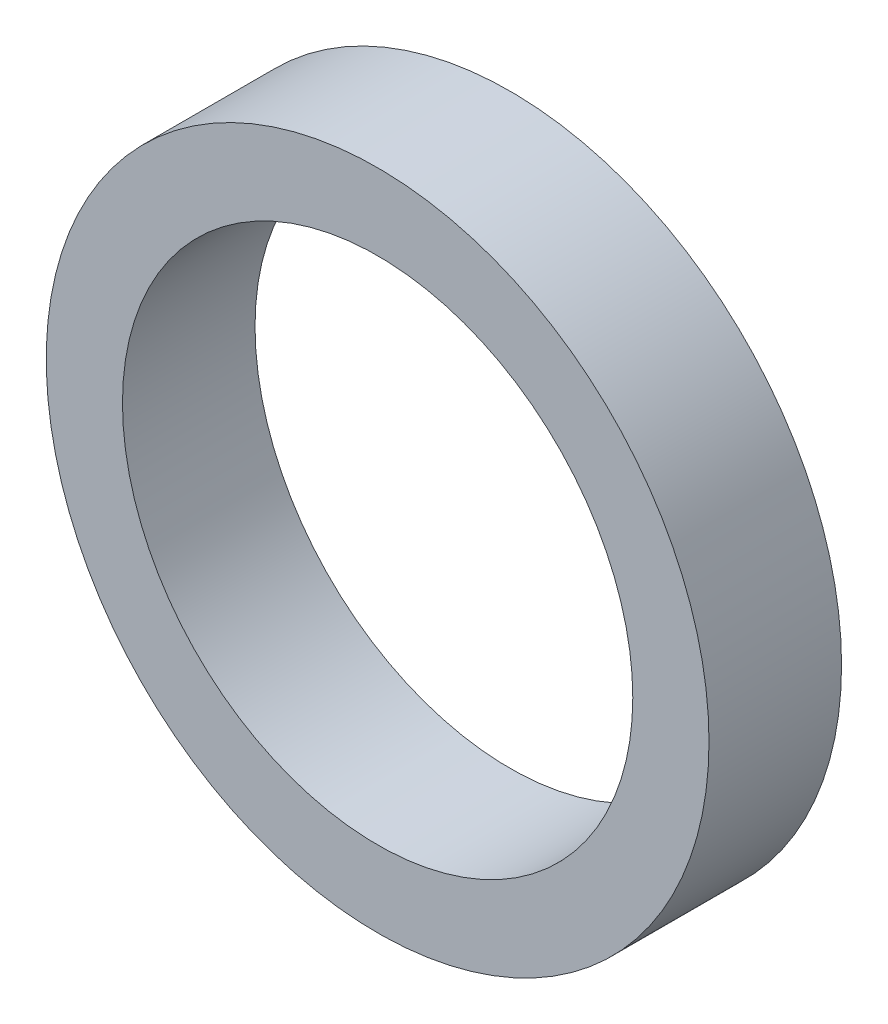
ISO-10303-21;
HEADER;
FILE_DESCRIPTION(('STEP AP214'),'2;1');
FILE_NAME('part.step','',(''),(''),'','','');
FILE_SCHEMA(('AUTOMOTIVE_DESIGN { 1 0 10303 214 1 1 1 1 }'));
ENDSEC;
DATA;
#1=APPLICATION_CONTEXT('core data for automotive mechanical design processes');
#2=APPLICATION_PROTOCOL_DEFINITION('international standard','automotive_design',2000,#1);
#3=PRODUCT_CONTEXT('',#1,'mechanical');
#4=PRODUCT('Part','Part','',(#3));
#5=PRODUCT_RELATED_PRODUCT_CATEGORY('part','',(#4));
#6=PRODUCT_DEFINITION_FORMATION('','',#4);
#7=PRODUCT_DEFINITION_CONTEXT('part definition',#1,'design');
#8=PRODUCT_DEFINITION('design','',#6,#7);
#9=PRODUCT_DEFINITION_SHAPE('','',#8);
#10=(LENGTH_UNIT() NAMED_UNIT(*) SI_UNIT(.MILLI.,.METRE.));
#11=(NAMED_UNIT(*) PLANE_ANGLE_UNIT() SI_UNIT($,.RADIAN.));
#12=(NAMED_UNIT(*) SI_UNIT($,.STERADIAN.) SOLID_ANGLE_UNIT());
#13=UNCERTAINTY_MEASURE_WITH_UNIT(LENGTH_MEASURE(1.E-05),#10,'distance_accuracy_value','');
#14=(GEOMETRIC_REPRESENTATION_CONTEXT(3) GLOBAL_UNCERTAINTY_ASSIGNED_CONTEXT((#13)) GLOBAL_UNIT_ASSIGNED_CONTEXT((#10,
#11,#12)) REPRESENTATION_CONTEXT('',''));
#15=CARTESIAN_POINT('',(0.,0.,0.));
#16=DIRECTION('',(0.,0.,1.));
#17=DIRECTION('',(1.,0.,0.));
#18=AXIS2_PLACEMENT_3D('',#15,#16,#17);
#19=CARTESIAN_POINT('',(0.,0.,2.));
#20=DIRECTION('',(0.,0.,1.));
#21=DIRECTION('',(1.,0.,0.));
#22=AXIS2_PLACEMENT_3D('',#19,#20,#21);
#23=PLANE('',#22);
#24=CARTESIAN_POINT('',(0.,0.,2.));
#25=DIRECTION('',(0.,0.,1.));
#26=DIRECTION('',(1.,0.,0.));
#27=AXIS2_PLACEMENT_3D('',#24,#25,#26);
#28=CIRCLE('',#27,5.);
#29=CARTESIAN_POINT('',(5.,0.,2.));
#30=VERTEX_POINT('',#29);
#31=EDGE_CURVE('E10',#30,#30,#28,.T.);
#32=ORIENTED_EDGE('',*,*,#31,.T.);
#33=EDGE_LOOP('',(#32));
#34=FACE_BOUND('',#33,.T.);
#35=CARTESIAN_POINT('',(0.,0.,2.));
#36=DIRECTION('',(0.,0.,1.));
#37=DIRECTION('',(1.,0.,0.));
#38=AXIS2_PLACEMENT_3D('',#35,#36,#37);
#39=CIRCLE('',#38,3.85);
#40=CARTESIAN_POINT('',(3.85,0.,2.));
#41=VERTEX_POINT('',#40);
#42=EDGE_CURVE('E48',#41,#41,#39,.T.);
#43=ORIENTED_EDGE('',*,*,#42,.F.);
#44=EDGE_LOOP('',(#43));
#45=FACE_BOUND('',#44,.T.);
#46=ADVANCED_FACE('F34',(#34,#45),#23,.T.);
#47=CARTESIAN_POINT('',(0.,0.,0.));
#48=DIRECTION('',(0.,0.,1.));
#49=DIRECTION('',(1.,0.,0.));
#50=AXIS2_PLACEMENT_3D('',#47,#48,#49);
#51=PLANE('',#50);
#52=CARTESIAN_POINT('',(0.,0.,0.));
#53=DIRECTION('',(0.,0.,1.));
#54=DIRECTION('',(1.,0.,0.));
#55=AXIS2_PLACEMENT_3D('',#52,#53,#54);
#56=CIRCLE('',#55,5.);
#57=CARTESIAN_POINT('',(5.,0.,0.));
#58=VERTEX_POINT('',#57);
#59=EDGE_CURVE('E38',#58,#58,#56,.T.);
#60=ORIENTED_EDGE('',*,*,#59,.F.);
#61=EDGE_LOOP('',(#60));
#62=FACE_BOUND('',#61,.T.);
#63=CARTESIAN_POINT('',(0.,0.,0.));
#64=DIRECTION('',(0.,0.,1.));
#65=DIRECTION('',(1.,0.,0.));
#66=AXIS2_PLACEMENT_3D('',#63,#64,#65);
#67=CIRCLE('',#66,3.85);
#68=CARTESIAN_POINT('',(3.85,0.,0.));
#69=VERTEX_POINT('',#68);
#70=EDGE_CURVE('E50',#69,#69,#67,.T.);
#71=ORIENTED_EDGE('',*,*,#70,.T.);
#72=EDGE_LOOP('',(#71));
#73=FACE_BOUND('',#72,.T.);
#74=ADVANCED_FACE('F61',(#62,#73),#51,.F.);
#75=CARTESIAN_POINT('',(0.,0.,2.));
#76=DIRECTION('',(0.,0.,-1.));
#77=DIRECTION('',(-1.,0.,0.));
#78=AXIS2_PLACEMENT_3D('',#75,#76,#77);
#79=CYLINDRICAL_SURFACE('',#78,5.);
#80=ORIENTED_EDGE('',*,*,#31,.F.);
#81=EDGE_LOOP('',(#80));
#82=FACE_BOUND('',#81,.T.);
#83=ORIENTED_EDGE('',*,*,#59,.T.);
#84=EDGE_LOOP('',(#83));
#85=FACE_BOUND('',#84,.T.);
#86=ADVANCED_FACE('F36',(#82,#85),#79,.T.);
#87=CARTESIAN_POINT('',(0.,0.,2.));
#88=DIRECTION('',(0.,0.,-1.));
#89=DIRECTION('',(-1.,0.,0.));
#90=AXIS2_PLACEMENT_3D('',#87,#88,#89);
#91=CYLINDRICAL_SURFACE('',#90,3.85);
#92=ORIENTED_EDGE('',*,*,#42,.T.);
#93=EDGE_LOOP('',(#92));
#94=FACE_BOUND('',#93,.T.);
#95=ORIENTED_EDGE('',*,*,#70,.F.);
#96=EDGE_LOOP('',(#95));
#97=FACE_BOUND('',#96,.T.);
#98=ADVANCED_FACE('F57',(#94,#97),#91,.F.);
#99=CLOSED_SHELL('',(#46,#74,#86,#98));
#100=MANIFOLD_SOLID_BREP('B2',#99);
#101=ADVANCED_BREP_SHAPE_REPRESENTATION('',(#18,#100),#14);
#102=SHAPE_DEFINITION_REPRESENTATION(#9,#101);
ENDSEC;
END-ISO-10303-21;
